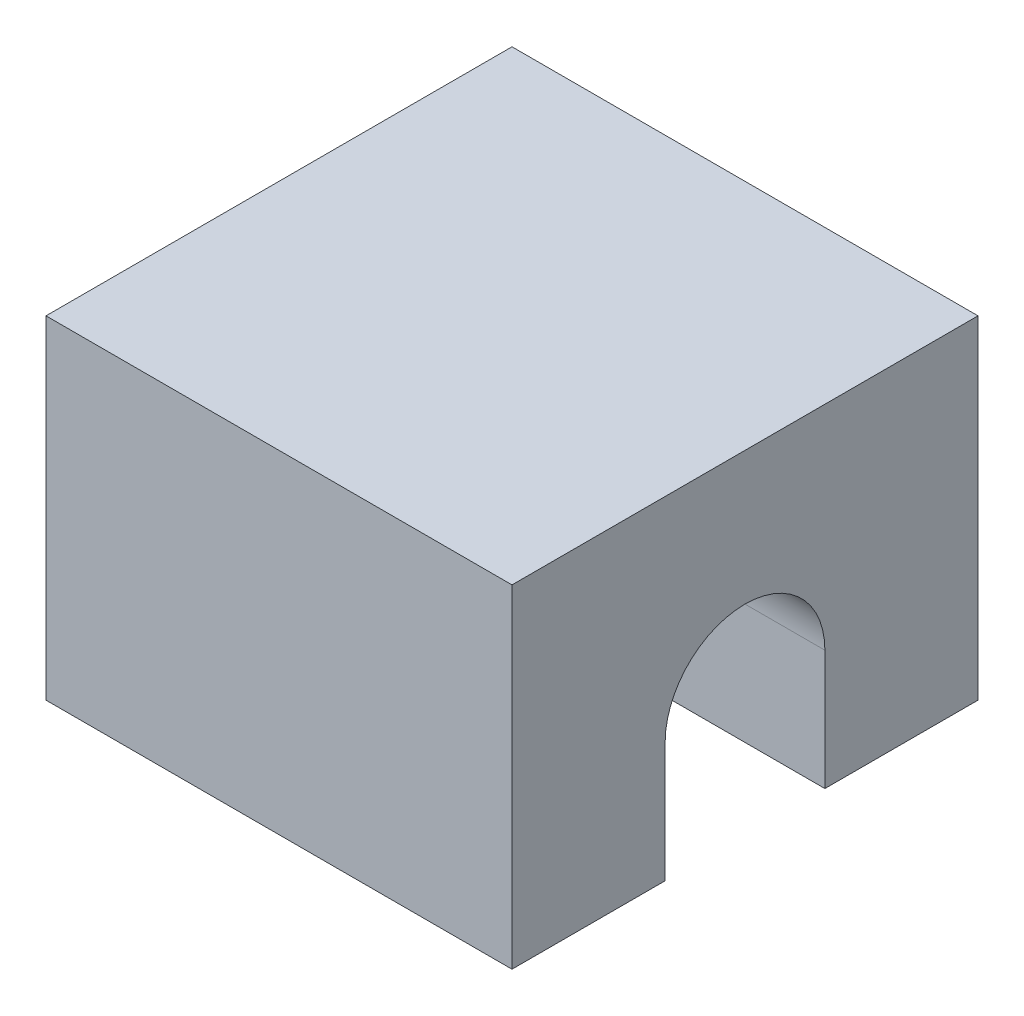
ISO-10303-21;
HEADER;
FILE_DESCRIPTION(('STEP AP214'),'2;1');
FILE_NAME('part.step','',(''),(''),'','','');
FILE_SCHEMA(('AUTOMOTIVE_DESIGN { 1 0 10303 214 1 1 1 1 }'));
ENDSEC;
DATA;
#1=APPLICATION_CONTEXT('core data for automotive mechanical design processes');
#2=APPLICATION_PROTOCOL_DEFINITION('international standard','automotive_design',2000,#1);
#3=PRODUCT_CONTEXT('',#1,'mechanical');
#4=PRODUCT('Part','Part','',(#3));
#5=PRODUCT_RELATED_PRODUCT_CATEGORY('part','',(#4));
#6=PRODUCT_DEFINITION_FORMATION('','',#4);
#7=PRODUCT_DEFINITION_CONTEXT('part definition',#1,'design');
#8=PRODUCT_DEFINITION('design','',#6,#7);
#9=PRODUCT_DEFINITION_SHAPE('','',#8);
#10=(LENGTH_UNIT() NAMED_UNIT(*) SI_UNIT(.MILLI.,.METRE.));
#11=(NAMED_UNIT(*) PLANE_ANGLE_UNIT() SI_UNIT($,.RADIAN.));
#12=(NAMED_UNIT(*) SI_UNIT($,.STERADIAN.) SOLID_ANGLE_UNIT());
#13=UNCERTAINTY_MEASURE_WITH_UNIT(LENGTH_MEASURE(1.E-05),#10,'distance_accuracy_value','');
#14=(GEOMETRIC_REPRESENTATION_CONTEXT(3) GLOBAL_UNCERTAINTY_ASSIGNED_CONTEXT((#13)) GLOBAL_UNIT_ASSIGNED_CONTEXT((#10,
#11,#12)) REPRESENTATION_CONTEXT('',''));
#15=CARTESIAN_POINT('',(0.,0.,0.));
#16=DIRECTION('',(0.,0.,1.));
#17=DIRECTION('',(1.,0.,0.));
#18=AXIS2_PLACEMENT_3D('',#15,#16,#17);
#19=CARTESIAN_POINT('',(35.,0.781609195402294,8.82183908045977));
#20=DIRECTION('',(-1.,0.,0.));
#21=DIRECTION('',(0.,0.,1.));
#22=AXIS2_PLACEMENT_3D('',#19,#20,#21);
#23=CYLINDRICAL_SURFACE('',#22,6.);
#24=CARTESIAN_POINT('',(0.,0.781609195402294,8.82183908045977));
#25=DIRECTION('',(1.,0.,0.));
#26=DIRECTION('',(0.,0.,-1.));
#27=AXIS2_PLACEMENT_3D('',#24,#25,#26);
#28=CIRCLE('',#27,6.);
#29=CARTESIAN_POINT('',(0.,0.781609195402294,2.82183908045977));
#30=VERTEX_POINT('',#29);
#31=CARTESIAN_POINT('',(0.,0.781609195402294,14.8218390804598));
#32=VERTEX_POINT('',#31);
#33=EDGE_CURVE('E129',#30,#32,#28,.T.);
#34=ORIENTED_EDGE('',*,*,#33,.F.);
#35=DIRECTION('',(-1.,0.,0.));
#36=VECTOR('',#35,1.);
#37=CARTESIAN_POINT('',(35.,0.781609195402294,2.82183908045977));
#38=LINE('',#37,#36);
#39=CARTESIAN_POINT('',(35.,0.781609195402294,2.82183908045977));
#40=VERTEX_POINT('',#39);
#41=EDGE_CURVE('E11',#40,#30,#38,.T.);
#42=ORIENTED_EDGE('',*,*,#41,.F.);
#43=CARTESIAN_POINT('',(35.,0.781609195402294,8.82183908045977));
#44=DIRECTION('',(1.,0.,0.));
#45=DIRECTION('',(0.,0.,-1.));
#46=AXIS2_PLACEMENT_3D('',#43,#44,#45);
#47=CIRCLE('',#46,6.);
#48=CARTESIAN_POINT('',(35.,0.781609195402294,14.8218390804598));
#49=VERTEX_POINT('',#48);
#50=EDGE_CURVE('E148',#40,#49,#47,.T.);
#51=ORIENTED_EDGE('',*,*,#50,.T.);
#52=DIRECTION('',(-1.,0.,0.));
#53=VECTOR('',#52,1.);
#54=CARTESIAN_POINT('',(35.,0.781609195402294,14.8218390804598));
#55=LINE('',#54,#53);
#56=EDGE_CURVE('E51',#49,#32,#55,.T.);
#57=ORIENTED_EDGE('',*,*,#56,.T.);
#58=EDGE_LOOP('',(#34,#42,#51,#57));
#59=FACE_BOUND('',#58,.T.);
#60=ADVANCED_FACE('F35',(#59),#23,.F.);
#61=CARTESIAN_POINT('',(35.,0.,2.82183908045977));
#62=DIRECTION('',(0.,0.,-1.));
#63=DIRECTION('',(-1.,0.,0.));
#64=AXIS2_PLACEMENT_3D('',#61,#62,#63);
#65=PLANE('',#64);
#66=DIRECTION('',(0.,-1.,0.));
#67=VECTOR('',#66,1.);
#68=CARTESIAN_POINT('',(0.,0.,2.82183908045977));
#69=LINE('',#68,#67);
#70=CARTESIAN_POINT('',(0.,-8.21839080459771,2.82183908045977));
#71=VERTEX_POINT('',#70);
#72=EDGE_CURVE('E131',#30,#71,#69,.T.);
#73=ORIENTED_EDGE('',*,*,#72,.T.);
#74=DIRECTION('',(-1.,0.,0.));
#75=VECTOR('',#74,1.);
#76=CARTESIAN_POINT('',(35.,-8.21839080459771,2.82183908045977));
#77=LINE('',#76,#75);
#78=CARTESIAN_POINT('',(35.,-8.21839080459771,2.82183908045977));
#79=VERTEX_POINT('',#78);
#80=EDGE_CURVE('E43',#79,#71,#77,.T.);
#81=ORIENTED_EDGE('',*,*,#80,.F.);
#82=DIRECTION('',(0.,-1.,0.));
#83=VECTOR('',#82,1.);
#84=CARTESIAN_POINT('',(35.,0.,2.82183908045977));
#85=LINE('',#84,#83);
#86=EDGE_CURVE('E174',#40,#79,#85,.T.);
#87=ORIENTED_EDGE('',*,*,#86,.F.);
#88=ORIENTED_EDGE('',*,*,#41,.T.);
#89=EDGE_LOOP('',(#73,#81,#87,#88));
#90=FACE_BOUND('',#89,.T.);
#91=ADVANCED_FACE('F189',(#90),#65,.F.);
#92=CARTESIAN_POINT('',(35.,-8.21839080459771,0.));
#93=DIRECTION('',(0.,1.,0.));
#94=DIRECTION('',(0.,0.,1.));
#95=AXIS2_PLACEMENT_3D('',#92,#93,#94);
#96=PLANE('',#95);
#97=DIRECTION('',(0.,0.,-1.));
#98=VECTOR('',#97,1.);
#99=CARTESIAN_POINT('',(0.,-8.21839080459771,0.));
#100=LINE('',#99,#98);
#101=CARTESIAN_POINT('',(0.,-8.21839080459771,-8.67816091954024));
#102=VERTEX_POINT('',#101);
#103=EDGE_CURVE('E133',#71,#102,#100,.T.);
#104=ORIENTED_EDGE('',*,*,#103,.T.);
#105=DIRECTION('',(-1.,0.,0.));
#106=VECTOR('',#105,1.);
#107=CARTESIAN_POINT('',(35.,-8.21839080459771,-8.67816091954024));
#108=LINE('',#107,#106);
#109=CARTESIAN_POINT('',(35.,-8.21839080459771,-8.67816091954024));
#110=VERTEX_POINT('',#109);
#111=EDGE_CURVE('E154',#110,#102,#108,.T.);
#112=ORIENTED_EDGE('',*,*,#111,.F.);
#113=DIRECTION('',(0.,0.,-1.));
#114=VECTOR('',#113,1.);
#115=CARTESIAN_POINT('',(35.,-8.21839080459771,0.));
#116=LINE('',#115,#114);
#117=EDGE_CURVE('E162',#79,#110,#116,.T.);
#118=ORIENTED_EDGE('',*,*,#117,.F.);
#119=ORIENTED_EDGE('',*,*,#80,.T.);
#120=EDGE_LOOP('',(#104,#112,#118,#119));
#121=FACE_BOUND('',#120,.T.);
#122=ADVANCED_FACE('F160',(#121),#96,.F.);
#123=CARTESIAN_POINT('',(35.,0.,-8.67816091954024));
#124=DIRECTION('',(0.,0.,-1.));
#125=DIRECTION('',(0.,1.,0.));
#126=AXIS2_PLACEMENT_3D('',#123,#124,#125);
#127=PLANE('',#126);
#128=DIRECTION('',(0.,-1.,0.));
#129=VECTOR('',#128,1.);
#130=CARTESIAN_POINT('',(0.,0.,-8.67816091954024));
#131=LINE('',#130,#129);
#132=CARTESIAN_POINT('',(0.,16.7816091954023,-8.67816091954023));
#133=VERTEX_POINT('',#132);
#134=EDGE_CURVE('E136',#133,#102,#131,.T.);
#135=ORIENTED_EDGE('',*,*,#134,.F.);
#136=DIRECTION('',(-1.,0.,0.));
#137=VECTOR('',#136,1.);
#138=CARTESIAN_POINT('',(35.,16.7816091954023,-8.67816091954023));
#139=LINE('',#138,#137);
#140=CARTESIAN_POINT('',(35.,16.7816091954023,-8.67816091954023));
#141=VERTEX_POINT('',#140);
#142=EDGE_CURVE('E152',#141,#133,#139,.T.);
#143=ORIENTED_EDGE('',*,*,#142,.F.);
#144=DIRECTION('',(0.,-1.,0.));
#145=VECTOR('',#144,1.);
#146=CARTESIAN_POINT('',(35.,0.,-8.67816091954024));
#147=LINE('',#146,#145);
#148=EDGE_CURVE('E172',#141,#110,#147,.T.);
#149=ORIENTED_EDGE('',*,*,#148,.T.);
#150=ORIENTED_EDGE('',*,*,#111,.T.);
#151=EDGE_LOOP('',(#135,#143,#149,#150));
#152=FACE_BOUND('',#151,.T.);
#153=ADVANCED_FACE('F170',(#152),#127,.T.);
#154=CARTESIAN_POINT('',(35.,16.7816091954023,0.));
#155=DIRECTION('',(0.,1.,0.));
#156=DIRECTION('',(0.,0.,1.));
#157=AXIS2_PLACEMENT_3D('',#154,#155,#156);
#158=PLANE('',#157);
#159=DIRECTION('',(0.,0.,-1.));
#160=VECTOR('',#159,1.);
#161=CARTESIAN_POINT('',(0.,16.7816091954023,0.));
#162=LINE('',#161,#160);
#163=CARTESIAN_POINT('',(0.,16.7816091954023,26.3218390804598));
#164=VERTEX_POINT('',#163);
#165=EDGE_CURVE('E139',#164,#133,#162,.T.);
#166=ORIENTED_EDGE('',*,*,#165,.F.);
#167=DIRECTION('',(-1.,0.,0.));
#168=VECTOR('',#167,1.);
#169=CARTESIAN_POINT('',(35.,16.7816091954023,26.3218390804598));
#170=LINE('',#169,#168);
#171=CARTESIAN_POINT('',(35.,16.7816091954023,26.3218390804598));
#172=VERTEX_POINT('',#171);
#173=EDGE_CURVE('E121',#172,#164,#170,.T.);
#174=ORIENTED_EDGE('',*,*,#173,.F.);
#175=DIRECTION('',(0.,0.,-1.));
#176=VECTOR('',#175,1.);
#177=CARTESIAN_POINT('',(35.,16.7816091954023,0.));
#178=LINE('',#177,#176);
#179=EDGE_CURVE('E111',#172,#141,#178,.T.);
#180=ORIENTED_EDGE('',*,*,#179,.T.);
#181=ORIENTED_EDGE('',*,*,#142,.T.);
#182=EDGE_LOOP('',(#166,#174,#180,#181));
#183=FACE_BOUND('',#182,.T.);
#184=ADVANCED_FACE('F200',(#183),#158,.T.);
#185=CARTESIAN_POINT('',(35.,0.,26.3218390804598));
#186=DIRECTION('',(0.,0.,-1.));
#187=DIRECTION('',(0.,1.,0.));
#188=AXIS2_PLACEMENT_3D('',#185,#186,#187);
#189=PLANE('',#188);
#190=DIRECTION('',(0.,-1.,0.));
#191=VECTOR('',#190,1.);
#192=CARTESIAN_POINT('',(0.,0.,26.3218390804598));
#193=LINE('',#192,#191);
#194=CARTESIAN_POINT('',(0.,-8.21839080459771,26.3218390804598));
#195=VERTEX_POINT('',#194);
#196=EDGE_CURVE('E118',#164,#195,#193,.T.);
#197=ORIENTED_EDGE('',*,*,#196,.T.);
#198=DIRECTION('',(-1.,0.,0.));
#199=VECTOR('',#198,1.);
#200=CARTESIAN_POINT('',(35.,-8.21839080459771,26.3218390804598));
#201=LINE('',#200,#199);
#202=CARTESIAN_POINT('',(35.,-8.21839080459771,26.3218390804598));
#203=VERTEX_POINT('',#202);
#204=EDGE_CURVE('E115',#203,#195,#201,.T.);
#205=ORIENTED_EDGE('',*,*,#204,.F.);
#206=DIRECTION('',(0.,-1.,0.));
#207=VECTOR('',#206,1.);
#208=CARTESIAN_POINT('',(35.,0.,26.3218390804598));
#209=LINE('',#208,#207);
#210=EDGE_CURVE('E102',#172,#203,#209,.T.);
#211=ORIENTED_EDGE('',*,*,#210,.F.);
#212=ORIENTED_EDGE('',*,*,#173,.T.);
#213=EDGE_LOOP('',(#197,#205,#211,#212));
#214=FACE_BOUND('',#213,.T.);
#215=ADVANCED_FACE('F116',(#214),#189,.F.);
#216=CARTESIAN_POINT('',(35.,-8.21839080459771,0.));
#217=DIRECTION('',(0.,1.,0.));
#218=DIRECTION('',(0.,0.,1.));
#219=AXIS2_PLACEMENT_3D('',#216,#217,#218);
#220=PLANE('',#219);
#221=DIRECTION('',(0.,0.,-1.));
#222=VECTOR('',#221,1.);
#223=CARTESIAN_POINT('',(0.,-8.21839080459771,0.));
#224=LINE('',#223,#222);
#225=CARTESIAN_POINT('',(0.,-8.21839080459771,14.8218390804598));
#226=VERTEX_POINT('',#225);
#227=EDGE_CURVE('E143',#195,#226,#224,.T.);
#228=ORIENTED_EDGE('',*,*,#227,.T.);
#229=DIRECTION('',(-1.,0.,0.));
#230=VECTOR('',#229,1.);
#231=CARTESIAN_POINT('',(35.,-8.21839080459771,14.8218390804598));
#232=LINE('',#231,#230);
#233=CARTESIAN_POINT('',(35.,-8.21839080459771,14.8218390804598));
#234=VERTEX_POINT('',#233);
#235=EDGE_CURVE('E77',#234,#226,#232,.T.);
#236=ORIENTED_EDGE('',*,*,#235,.F.);
#237=DIRECTION('',(0.,0.,-1.));
#238=VECTOR('',#237,1.);
#239=CARTESIAN_POINT('',(35.,-8.21839080459771,0.));
#240=LINE('',#239,#238);
#241=EDGE_CURVE('E108',#203,#234,#240,.T.);
#242=ORIENTED_EDGE('',*,*,#241,.F.);
#243=ORIENTED_EDGE('',*,*,#204,.T.);
#244=EDGE_LOOP('',(#228,#236,#242,#243));
#245=FACE_BOUND('',#244,.T.);
#246=ADVANCED_FACE('F123',(#245),#220,.F.);
#247=CARTESIAN_POINT('',(35.,0.,14.8218390804598));
#248=DIRECTION('',(0.,0.,-1.));
#249=DIRECTION('',(-1.,0.,0.));
#250=AXIS2_PLACEMENT_3D('',#247,#248,#249);
#251=PLANE('',#250);
#252=DIRECTION('',(0.,-1.,0.));
#253=VECTOR('',#252,1.);
#254=CARTESIAN_POINT('',(0.,0.,14.8218390804598));
#255=LINE('',#254,#253);
#256=EDGE_CURVE('E145',#32,#226,#255,.T.);
#257=ORIENTED_EDGE('',*,*,#256,.F.);
#258=ORIENTED_EDGE('',*,*,#56,.F.);
#259=DIRECTION('',(0.,-1.,0.));
#260=VECTOR('',#259,1.);
#261=CARTESIAN_POINT('',(35.,0.,14.8218390804598));
#262=LINE('',#261,#260);
#263=EDGE_CURVE('E124',#49,#234,#262,.T.);
#264=ORIENTED_EDGE('',*,*,#263,.T.);
#265=ORIENTED_EDGE('',*,*,#235,.T.);
#266=EDGE_LOOP('',(#257,#258,#264,#265));
#267=FACE_BOUND('',#266,.T.);
#268=ADVANCED_FACE('F178',(#267),#251,.T.);
#269=CARTESIAN_POINT('',(35.,0.,0.));
#270=DIRECTION('',(1.,0.,0.));
#271=DIRECTION('',(0.,0.,-1.));
#272=AXIS2_PLACEMENT_3D('',#269,#270,#271);
#273=PLANE('',#272);
#274=ORIENTED_EDGE('',*,*,#50,.F.);
#275=ORIENTED_EDGE('',*,*,#86,.T.);
#276=ORIENTED_EDGE('',*,*,#117,.T.);
#277=ORIENTED_EDGE('',*,*,#148,.F.);
#278=ORIENTED_EDGE('',*,*,#179,.F.);
#279=ORIENTED_EDGE('',*,*,#210,.T.);
#280=ORIENTED_EDGE('',*,*,#241,.T.);
#281=ORIENTED_EDGE('',*,*,#263,.F.);
#282=EDGE_LOOP('',(#274,#275,#276,#277,#278,#279,#280,#281));
#283=FACE_BOUND('',#282,.T.);
#284=ADVANCED_FACE('F105',(#283),#273,.T.);
#285=CARTESIAN_POINT('',(0.,0.,0.));
#286=DIRECTION('',(1.,0.,0.));
#287=DIRECTION('',(0.,0.,-1.));
#288=AXIS2_PLACEMENT_3D('',#285,#286,#287);
#289=PLANE('',#288);
#290=ORIENTED_EDGE('',*,*,#33,.T.);
#291=ORIENTED_EDGE('',*,*,#256,.T.);
#292=ORIENTED_EDGE('',*,*,#227,.F.);
#293=ORIENTED_EDGE('',*,*,#196,.F.);
#294=ORIENTED_EDGE('',*,*,#165,.T.);
#295=ORIENTED_EDGE('',*,*,#134,.T.);
#296=ORIENTED_EDGE('',*,*,#103,.F.);
#297=ORIENTED_EDGE('',*,*,#72,.F.);
#298=EDGE_LOOP('',(#290,#291,#292,#293,#294,#295,#296,#297));
#299=FACE_BOUND('',#298,.T.);
#300=ADVANCED_FACE('F166',(#299),#289,.F.);
#301=CLOSED_SHELL('',(#60,#91,#122,#153,#184,#215,#246,#268,#284,#300));
#302=MANIFOLD_SOLID_BREP('B2',#301);
#303=ADVANCED_BREP_SHAPE_REPRESENTATION('',(#18,#302),#14);
#304=SHAPE_DEFINITION_REPRESENTATION(#9,#303);
ENDSEC;
END-ISO-10303-21;
